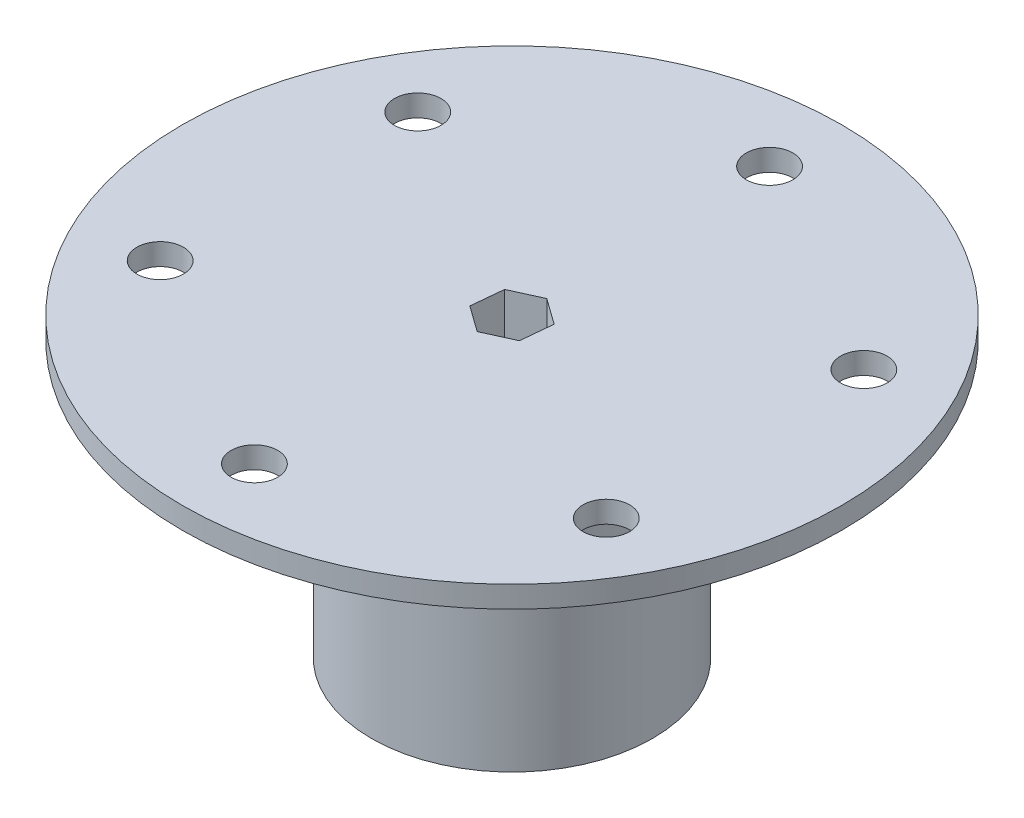
ISO-10303-21;
HEADER;
FILE_DESCRIPTION(('STEP AP214'),'2;1');
FILE_NAME('part.step','',(''),(''),'','','');
FILE_SCHEMA(('AUTOMOTIVE_DESIGN { 1 0 10303 214 1 1 1 1 }'));
ENDSEC;
DATA;
#1=APPLICATION_CONTEXT('core data for automotive mechanical design processes');
#2=APPLICATION_PROTOCOL_DEFINITION('international standard','automotive_design',2000,#1);
#3=PRODUCT_CONTEXT('',#1,'mechanical');
#4=PRODUCT('Part','Part','',(#3));
#5=PRODUCT_RELATED_PRODUCT_CATEGORY('part','',(#4));
#6=PRODUCT_DEFINITION_FORMATION('','',#4);
#7=PRODUCT_DEFINITION_CONTEXT('part definition',#1,'design');
#8=PRODUCT_DEFINITION('design','',#6,#7);
#9=PRODUCT_DEFINITION_SHAPE('','',#8);
#10=(LENGTH_UNIT() NAMED_UNIT(*) SI_UNIT(.MILLI.,.METRE.));
#11=(NAMED_UNIT(*) PLANE_ANGLE_UNIT() SI_UNIT($,.RADIAN.));
#12=(NAMED_UNIT(*) SI_UNIT($,.STERADIAN.) SOLID_ANGLE_UNIT());
#13=UNCERTAINTY_MEASURE_WITH_UNIT(LENGTH_MEASURE(1.E-05),#10,'distance_accuracy_value','');
#14=(GEOMETRIC_REPRESENTATION_CONTEXT(3) GLOBAL_UNCERTAINTY_ASSIGNED_CONTEXT((#13)) GLOBAL_UNIT_ASSIGNED_CONTEXT((#10,
#11,#12)) REPRESENTATION_CONTEXT('',''));
#15=CARTESIAN_POINT('',(0.,0.,0.));
#16=DIRECTION('',(0.,0.,1.));
#17=DIRECTION('',(1.,0.,0.));
#18=AXIS2_PLACEMENT_3D('',#15,#16,#17);
#19=CARTESIAN_POINT('',(0.,2.,0.));
#20=DIRECTION('',(0.,1.,0.));
#21=DIRECTION('',(0.,0.,1.));
#22=AXIS2_PLACEMENT_3D('',#19,#20,#21);
#23=PLANE('',#22);
#24=DIRECTION('',(-0.910380768537709,0.,0.413771502494662));
#25=VECTOR('',#24,1.);
#26=CARTESIAN_POINT('',(-1.05511733136139,2.,-2.32147095977116));
#27=LINE('',#26,#25);
#28=CARTESIAN_POINT('',(0.285184552178387,2.,-2.93064323505929));
#29=VERTEX_POINT('',#28);
#30=CARTESIAN_POINT('',(-2.39541921490117,2.,-1.71229868448302));
#31=VERTEX_POINT('',#30);
#32=EDGE_CURVE('E50',#29,#31,#27,.T.);
#33=ORIENTED_EDGE('',*,*,#32,.F.);
#34=DIRECTION('',(-0.813527016791288,0.,-0.581527121423126));
#35=VECTOR('',#34,1.);
#36=CARTESIAN_POINT('',(1.48289415962897,2.,-2.07449389281778));
#37=LINE('',#36,#35);
#38=CARTESIAN_POINT('',(2.68060376707955,2.,-1.21834455057628));
#39=VERTEX_POINT('',#38);
#40=EDGE_CURVE('E134',#39,#29,#37,.T.);
#41=ORIENTED_EDGE('',*,*,#40,.F.);
#42=DIRECTION('',(0.096853751746421,0.,-0.995298623917788));
#43=VECTOR('',#42,1.);
#44=CARTESIAN_POINT('',(2.53801149099036,2.,0.246977066953373));
#45=LINE('',#44,#43);
#46=CARTESIAN_POINT('',(2.39541921490116,2.,1.71229868448302));
#47=VERTEX_POINT('',#46);
#48=EDGE_CURVE('E93',#47,#39,#45,.T.);
#49=ORIENTED_EDGE('',*,*,#48,.F.);
#50=DIRECTION('',(0.910380768537709,0.,-0.413771502494662));
#51=VECTOR('',#50,1.);
#52=CARTESIAN_POINT('',(1.05511733136139,2.,2.32147095977116));
#53=LINE('',#52,#51);
#54=CARTESIAN_POINT('',(-0.285184552178392,2.,2.9306432350593));
#55=VERTEX_POINT('',#54);
#56=EDGE_CURVE('E130',#55,#47,#53,.T.);
#57=ORIENTED_EDGE('',*,*,#56,.F.);
#58=DIRECTION('',(0.813527016791288,0.,0.581527121423126));
#59=VECTOR('',#58,1.);
#60=CARTESIAN_POINT('',(-1.48289415962897,2.,2.07449389281779));
#61=LINE('',#60,#59);
#62=CARTESIAN_POINT('',(-2.68060376707956,2.,1.21834455057628));
#63=VERTEX_POINT('',#62);
#64=EDGE_CURVE('E127',#63,#55,#61,.T.);
#65=ORIENTED_EDGE('',*,*,#64,.F.);
#66=DIRECTION('',(-0.096853751746421,0.,0.995298623917788));
#67=VECTOR('',#66,1.);
#68=CARTESIAN_POINT('',(-2.53801149099036,2.,-0.246977066953374));
#69=LINE('',#68,#67);
#70=EDGE_CURVE('E124',#31,#63,#69,.T.);
#71=ORIENTED_EDGE('',*,*,#70,.F.);
#72=EDGE_LOOP('',(#33,#41,#49,#57,#65,#71));
#73=FACE_BOUND('',#72,.T.);
#74=CARTESIAN_POINT('',(-20.6222299276169,2.,-11.90625));
#75=DIRECTION('',(0.,1.,0.));
#76=DIRECTION('',(0.,0.,1.));
#77=AXIS2_PLACEMENT_3D('',#74,#75,#76);
#78=CIRCLE('',#77,2.15265);
#79=CARTESIAN_POINT('',(-20.6222299276169,2.,-9.7536));
#80=VERTEX_POINT('',#79);
#81=EDGE_CURVE('E151',#80,#80,#78,.T.);
#82=ORIENTED_EDGE('',*,*,#81,.F.);
#83=EDGE_LOOP('',(#82));
#84=FACE_BOUND('',#83,.T.);
#85=CARTESIAN_POINT('',(20.6222299276168,2.,-11.9062500000002));
#86=DIRECTION('',(0.,1.,0.));
#87=DIRECTION('',(0.,0.,1.));
#88=AXIS2_PLACEMENT_3D('',#85,#86,#87);
#89=CIRCLE('',#88,2.15265);
#90=CARTESIAN_POINT('',(20.6222299276168,2.,-9.75360000000024));
#91=VERTEX_POINT('',#90);
#92=EDGE_CURVE('E163',#91,#91,#89,.T.);
#93=ORIENTED_EDGE('',*,*,#92,.F.);
#94=EDGE_LOOP('',(#93));
#95=FACE_BOUND('',#94,.T.);
#96=CARTESIAN_POINT('',(0.,2.,23.8125));
#97=DIRECTION('',(0.,1.,0.));
#98=DIRECTION('',(0.,0.,1.));
#99=AXIS2_PLACEMENT_3D('',#96,#97,#98);
#100=CIRCLE('',#99,2.15265);
#101=CARTESIAN_POINT('',(0.,2.,25.96515));
#102=VERTEX_POINT('',#101);
#103=EDGE_CURVE('E175',#102,#102,#100,.T.);
#104=ORIENTED_EDGE('',*,*,#103,.F.);
#105=EDGE_LOOP('',(#104));
#106=FACE_BOUND('',#105,.T.);
#107=CARTESIAN_POINT('',(0.,2.,0.));
#108=DIRECTION('',(0.,1.,0.));
#109=DIRECTION('',(0.,0.,1.));
#110=AXIS2_PLACEMENT_3D('',#107,#108,#109);
#111=CIRCLE('',#110,30.48);
#112=CARTESIAN_POINT('',(0.,2.,30.48));
#113=VERTEX_POINT('',#112);
#114=EDGE_CURVE('E43',#113,#113,#111,.T.);
#115=ORIENTED_EDGE('',*,*,#114,.T.);
#116=EDGE_LOOP('',(#115));
#117=FACE_BOUND('',#116,.T.);
#118=CARTESIAN_POINT('',(20.622229927617,2.,11.9062499999998));
#119=DIRECTION('',(0.,1.,0.));
#120=DIRECTION('',(0.,0.,1.));
#121=AXIS2_PLACEMENT_3D('',#118,#119,#120);
#122=CIRCLE('',#121,2.15265);
#123=CARTESIAN_POINT('',(20.622229927617,2.,14.0588999999998));
#124=VERTEX_POINT('',#123);
#125=EDGE_CURVE('E169',#124,#124,#122,.T.);
#126=ORIENTED_EDGE('',*,*,#125,.F.);
#127=EDGE_LOOP('',(#126));
#128=FACE_BOUND('',#127,.T.);
#129=CARTESIAN_POINT('',(0.,2.,-23.8125));
#130=DIRECTION('',(0.,1.,0.));
#131=DIRECTION('',(0.,0.,1.));
#132=AXIS2_PLACEMENT_3D('',#129,#130,#131);
#133=CIRCLE('',#132,2.15265);
#134=CARTESIAN_POINT('',(0.,2.,-21.65985));
#135=VERTEX_POINT('',#134);
#136=EDGE_CURVE('E157',#135,#135,#133,.T.);
#137=ORIENTED_EDGE('',*,*,#136,.F.);
#138=EDGE_LOOP('',(#137));
#139=FACE_BOUND('',#138,.T.);
#140=CARTESIAN_POINT('',(-20.6222299276169,2.,11.90625));
#141=DIRECTION('',(0.,1.,0.));
#142=DIRECTION('',(0.,0.,1.));
#143=AXIS2_PLACEMENT_3D('',#140,#141,#142);
#144=CIRCLE('',#143,2.15265);
#145=CARTESIAN_POINT('',(-20.6222299276169,2.,14.0589));
#146=VERTEX_POINT('',#145);
#147=EDGE_CURVE('E145',#146,#146,#144,.T.);
#148=ORIENTED_EDGE('',*,*,#147,.F.);
#149=EDGE_LOOP('',(#148));
#150=FACE_BOUND('',#149,.T.);
#151=ADVANCED_FACE('F35',(#73,#84,#95,#106,#117,#128,#139,#150),#23,.T.);
#152=CARTESIAN_POINT('',(0.,0.,0.));
#153=DIRECTION('',(0.,1.,0.));
#154=DIRECTION('',(0.,0.,1.));
#155=AXIS2_PLACEMENT_3D('',#152,#153,#154);
#156=PLANE('',#155);
#157=CARTESIAN_POINT('',(0.,0.,0.));
#158=DIRECTION('',(0.,1.,0.));
#159=DIRECTION('',(0.,0.,1.));
#160=AXIS2_PLACEMENT_3D('',#157,#158,#159);
#161=CIRCLE('',#160,13.);
#162=CARTESIAN_POINT('',(0.,0.,13.));
#163=VERTEX_POINT('',#162);
#164=EDGE_CURVE('E11',#163,#163,#161,.F.);
#165=ORIENTED_EDGE('',*,*,#164,.F.);
#166=EDGE_LOOP('',(#165));
#167=FACE_BOUND('',#166,.T.);
#168=CARTESIAN_POINT('',(0.,0.,0.));
#169=DIRECTION('',(0.,1.,0.));
#170=DIRECTION('',(0.,0.,1.));
#171=AXIS2_PLACEMENT_3D('',#168,#169,#170);
#172=CIRCLE('',#171,30.48);
#173=CARTESIAN_POINT('',(0.,0.,30.48));
#174=VERTEX_POINT('',#173);
#175=EDGE_CURVE('E178',#174,#174,#172,.T.);
#176=ORIENTED_EDGE('',*,*,#175,.F.);
#177=EDGE_LOOP('',(#176));
#178=FACE_BOUND('',#177,.T.);
#179=CARTESIAN_POINT('',(0.,0.,23.8125));
#180=DIRECTION('',(0.,1.,0.));
#181=DIRECTION('',(0.,0.,1.));
#182=AXIS2_PLACEMENT_3D('',#179,#180,#181);
#183=CIRCLE('',#182,2.15265);
#184=CARTESIAN_POINT('',(0.,0.,25.96515));
#185=VERTEX_POINT('',#184);
#186=EDGE_CURVE('E172',#185,#185,#183,.T.);
#187=ORIENTED_EDGE('',*,*,#186,.T.);
#188=EDGE_LOOP('',(#187));
#189=FACE_BOUND('',#188,.T.);
#190=CARTESIAN_POINT('',(20.622229927617,0.,11.9062499999998));
#191=DIRECTION('',(0.,1.,0.));
#192=DIRECTION('',(0.,0.,1.));
#193=AXIS2_PLACEMENT_3D('',#190,#191,#192);
#194=CIRCLE('',#193,2.15265);
#195=CARTESIAN_POINT('',(20.622229927617,0.,14.0588999999998));
#196=VERTEX_POINT('',#195);
#197=EDGE_CURVE('E166',#196,#196,#194,.T.);
#198=ORIENTED_EDGE('',*,*,#197,.T.);
#199=EDGE_LOOP('',(#198));
#200=FACE_BOUND('',#199,.T.);
#201=CARTESIAN_POINT('',(20.6222299276168,0.,-11.9062500000002));
#202=DIRECTION('',(0.,1.,0.));
#203=DIRECTION('',(0.,0.,1.));
#204=AXIS2_PLACEMENT_3D('',#201,#202,#203);
#205=CIRCLE('',#204,2.15265);
#206=CARTESIAN_POINT('',(20.6222299276168,0.,-9.75360000000024));
#207=VERTEX_POINT('',#206);
#208=EDGE_CURVE('E160',#207,#207,#205,.T.);
#209=ORIENTED_EDGE('',*,*,#208,.T.);
#210=EDGE_LOOP('',(#209));
#211=FACE_BOUND('',#210,.T.);
#212=CARTESIAN_POINT('',(0.,0.,-23.8125));
#213=DIRECTION('',(0.,1.,0.));
#214=DIRECTION('',(0.,0.,1.));
#215=AXIS2_PLACEMENT_3D('',#212,#213,#214);
#216=CIRCLE('',#215,2.15265);
#217=CARTESIAN_POINT('',(0.,0.,-21.65985));
#218=VERTEX_POINT('',#217);
#219=EDGE_CURVE('E154',#218,#218,#216,.T.);
#220=ORIENTED_EDGE('',*,*,#219,.T.);
#221=EDGE_LOOP('',(#220));
#222=FACE_BOUND('',#221,.T.);
#223=CARTESIAN_POINT('',(-20.6222299276169,0.,-11.90625));
#224=DIRECTION('',(0.,1.,0.));
#225=DIRECTION('',(0.,0.,1.));
#226=AXIS2_PLACEMENT_3D('',#223,#224,#225);
#227=CIRCLE('',#226,2.15265);
#228=CARTESIAN_POINT('',(-20.6222299276169,0.,-9.7536));
#229=VERTEX_POINT('',#228);
#230=EDGE_CURVE('E148',#229,#229,#227,.T.);
#231=ORIENTED_EDGE('',*,*,#230,.T.);
#232=EDGE_LOOP('',(#231));
#233=FACE_BOUND('',#232,.T.);
#234=CARTESIAN_POINT('',(-20.6222299276169,0.,11.90625));
#235=DIRECTION('',(0.,1.,0.));
#236=DIRECTION('',(0.,0.,1.));
#237=AXIS2_PLACEMENT_3D('',#234,#235,#236);
#238=CIRCLE('',#237,2.15265);
#239=CARTESIAN_POINT('',(-20.6222299276169,0.,14.0589));
#240=VERTEX_POINT('',#239);
#241=EDGE_CURVE('E137',#240,#240,#238,.T.);
#242=ORIENTED_EDGE('',*,*,#241,.T.);
#243=EDGE_LOOP('',(#242));
#244=FACE_BOUND('',#243,.T.);
#245=ADVANCED_FACE('F186',(#167,#178,#189,#200,#211,#222,#233,#244),#156,.F.);
#246=CARTESIAN_POINT('',(0.,2.,0.));
#247=DIRECTION('',(0.,-1.,0.));
#248=DIRECTION('',(0.,0.,-1.));
#249=AXIS2_PLACEMENT_3D('',#246,#247,#248);
#250=CYLINDRICAL_SURFACE('',#249,30.48);
#251=ORIENTED_EDGE('',*,*,#114,.F.);
#252=EDGE_LOOP('',(#251));
#253=FACE_BOUND('',#252,.T.);
#254=ORIENTED_EDGE('',*,*,#175,.T.);
#255=EDGE_LOOP('',(#254));
#256=FACE_BOUND('',#255,.T.);
#257=ADVANCED_FACE('F37',(#253,#256),#250,.T.);
#258=CARTESIAN_POINT('',(0.,2.,23.8125));
#259=DIRECTION('',(0.,-1.,0.));
#260=DIRECTION('',(0.,0.,-1.));
#261=AXIS2_PLACEMENT_3D('',#258,#259,#260);
#262=CYLINDRICAL_SURFACE('',#261,2.15265);
#263=ORIENTED_EDGE('',*,*,#103,.T.);
#264=EDGE_LOOP('',(#263));
#265=FACE_BOUND('',#264,.T.);
#266=ORIENTED_EDGE('',*,*,#186,.F.);
#267=EDGE_LOOP('',(#266));
#268=FACE_BOUND('',#267,.T.);
#269=ADVANCED_FACE('F223',(#265,#268),#262,.F.);
#270=CARTESIAN_POINT('',(20.622229927617,2.,11.9062499999998));
#271=DIRECTION('',(0.,-1.,0.));
#272=DIRECTION('',(0.,0.,-1.));
#273=AXIS2_PLACEMENT_3D('',#270,#271,#272);
#274=CYLINDRICAL_SURFACE('',#273,2.15265);
#275=ORIENTED_EDGE('',*,*,#125,.T.);
#276=EDGE_LOOP('',(#275));
#277=FACE_BOUND('',#276,.T.);
#278=ORIENTED_EDGE('',*,*,#197,.F.);
#279=EDGE_LOOP('',(#278));
#280=FACE_BOUND('',#279,.T.);
#281=ADVANCED_FACE('F226',(#277,#280),#274,.F.);
#282=CARTESIAN_POINT('',(20.6222299276168,2.,-11.9062500000002));
#283=DIRECTION('',(0.,-1.,0.));
#284=DIRECTION('',(0.,0.,-1.));
#285=AXIS2_PLACEMENT_3D('',#282,#283,#284);
#286=CYLINDRICAL_SURFACE('',#285,2.15265);
#287=ORIENTED_EDGE('',*,*,#92,.T.);
#288=EDGE_LOOP('',(#287));
#289=FACE_BOUND('',#288,.T.);
#290=ORIENTED_EDGE('',*,*,#208,.F.);
#291=EDGE_LOOP('',(#290));
#292=FACE_BOUND('',#291,.T.);
#293=ADVANCED_FACE('F230',(#289,#292),#286,.F.);
#294=CARTESIAN_POINT('',(0.,2.,-23.8125));
#295=DIRECTION('',(0.,-1.,0.));
#296=DIRECTION('',(0.,0.,-1.));
#297=AXIS2_PLACEMENT_3D('',#294,#295,#296);
#298=CYLINDRICAL_SURFACE('',#297,2.15265);
#299=ORIENTED_EDGE('',*,*,#136,.T.);
#300=EDGE_LOOP('',(#299));
#301=FACE_BOUND('',#300,.T.);
#302=ORIENTED_EDGE('',*,*,#219,.F.);
#303=EDGE_LOOP('',(#302));
#304=FACE_BOUND('',#303,.T.);
#305=ADVANCED_FACE('F213',(#301,#304),#298,.F.);
#306=CARTESIAN_POINT('',(-20.6222299276169,2.,-11.90625));
#307=DIRECTION('',(0.,-1.,0.));
#308=DIRECTION('',(0.,0.,-1.));
#309=AXIS2_PLACEMENT_3D('',#306,#307,#308);
#310=CYLINDRICAL_SURFACE('',#309,2.15265);
#311=ORIENTED_EDGE('',*,*,#81,.T.);
#312=EDGE_LOOP('',(#311));
#313=FACE_BOUND('',#312,.T.);
#314=ORIENTED_EDGE('',*,*,#230,.F.);
#315=EDGE_LOOP('',(#314));
#316=FACE_BOUND('',#315,.T.);
#317=ADVANCED_FACE('F205',(#313,#316),#310,.F.);
#318=CARTESIAN_POINT('',(-20.6222299276169,2.,11.90625));
#319=DIRECTION('',(0.,-1.,0.));
#320=DIRECTION('',(0.,0.,-1.));
#321=AXIS2_PLACEMENT_3D('',#318,#319,#320);
#322=CYLINDRICAL_SURFACE('',#321,2.15265);
#323=ORIENTED_EDGE('',*,*,#147,.T.);
#324=EDGE_LOOP('',(#323));
#325=FACE_BOUND('',#324,.T.);
#326=ORIENTED_EDGE('',*,*,#241,.F.);
#327=EDGE_LOOP('',(#326));
#328=FACE_BOUND('',#327,.T.);
#329=ADVANCED_FACE('F202',(#325,#328),#322,.F.);
#330=CARTESIAN_POINT('',(-1.05511733136139,-8.,-2.32147095977116));
#331=DIRECTION('',(-0.413771502494662,0.,-0.910380768537709));
#332=DIRECTION('',(-0.910380768537709,0.,0.413771502494662));
#333=AXIS2_PLACEMENT_3D('',#330,#331,#332);
#334=PLANE('',#333);
#335=DIRECTION('',(0.,1.,0.));
#336=VECTOR('',#335,1.);
#337=CARTESIAN_POINT('',(0.285184552178387,-8.,-2.93064323505929));
#338=LINE('',#337,#336);
#339=CARTESIAN_POINT('',(0.285184552178388,-25.4,-2.93064323505929));
#340=VERTEX_POINT('',#339);
#341=EDGE_CURVE('E55',#340,#29,#338,.T.);
#342=ORIENTED_EDGE('',*,*,#341,.T.);
#343=ORIENTED_EDGE('',*,*,#32,.T.);
#344=DIRECTION('',(0.,1.,0.));
#345=VECTOR('',#344,1.);
#346=CARTESIAN_POINT('',(-2.39541921490117,-8.,-1.71229868448302));
#347=LINE('',#346,#345);
#348=CARTESIAN_POINT('',(-2.39541921490117,-25.4,-1.71229868448302));
#349=VERTEX_POINT('',#348);
#350=EDGE_CURVE('E136',#349,#31,#347,.T.);
#351=ORIENTED_EDGE('',*,*,#350,.F.);
#352=DIRECTION('',(-0.910380768537709,0.,0.413771502494662));
#353=VECTOR('',#352,1.);
#354=CARTESIAN_POINT('',(-1.05511733136139,-25.4,-2.32147095977116));
#355=LINE('',#354,#353);
#356=EDGE_CURVE('E103',#340,#349,#355,.T.);
#357=ORIENTED_EDGE('',*,*,#356,.F.);
#358=EDGE_LOOP('',(#342,#343,#351,#357));
#359=FACE_BOUND('',#358,.T.);
#360=ADVANCED_FACE('F204',(#359),#334,.F.);
#361=CARTESIAN_POINT('',(1.48289415962897,-8.,-2.07449389281778));
#362=DIRECTION('',(0.581527121423126,0.,-0.813527016791288));
#363=DIRECTION('',(-0.813527016791288,0.,-0.581527121423126));
#364=AXIS2_PLACEMENT_3D('',#361,#362,#363);
#365=PLANE('',#364);
#366=DIRECTION('',(0.,1.,0.));
#367=VECTOR('',#366,1.);
#368=CARTESIAN_POINT('',(2.68060376707955,-8.,-1.21834455057628));
#369=LINE('',#368,#367);
#370=CARTESIAN_POINT('',(2.68060376707955,-25.4,-1.21834455057628));
#371=VERTEX_POINT('',#370);
#372=EDGE_CURVE('E87',#371,#39,#369,.T.);
#373=ORIENTED_EDGE('',*,*,#372,.T.);
#374=ORIENTED_EDGE('',*,*,#40,.T.);
#375=ORIENTED_EDGE('',*,*,#341,.F.);
#376=DIRECTION('',(-0.813527016791288,0.,-0.581527121423126));
#377=VECTOR('',#376,1.);
#378=CARTESIAN_POINT('',(1.48289415962897,-25.4,-2.07449389281778));
#379=LINE('',#378,#377);
#380=EDGE_CURVE('E99',#371,#340,#379,.T.);
#381=ORIENTED_EDGE('',*,*,#380,.F.);
#382=EDGE_LOOP('',(#373,#374,#375,#381));
#383=FACE_BOUND('',#382,.T.);
#384=ADVANCED_FACE('F100',(#383),#365,.F.);
#385=CARTESIAN_POINT('',(2.53801149099036,-8.,0.246977066953373));
#386=DIRECTION('',(0.995298623917788,0.,0.096853751746421));
#387=DIRECTION('',(0.096853751746421,0.,-0.995298623917788));
#388=AXIS2_PLACEMENT_3D('',#385,#386,#387);
#389=PLANE('',#388);
#390=DIRECTION('',(0.,1.,0.));
#391=VECTOR('',#390,1.);
#392=CARTESIAN_POINT('',(2.39541921490116,-8.,1.71229868448302));
#393=LINE('',#392,#391);
#394=CARTESIAN_POINT('',(2.39541921490116,-25.4,1.71229868448302));
#395=VERTEX_POINT('',#394);
#396=EDGE_CURVE('E96',#395,#47,#393,.T.);
#397=ORIENTED_EDGE('',*,*,#396,.T.);
#398=ORIENTED_EDGE('',*,*,#48,.T.);
#399=ORIENTED_EDGE('',*,*,#372,.F.);
#400=DIRECTION('',(0.096853751746421,0.,-0.995298623917788));
#401=VECTOR('',#400,1.);
#402=CARTESIAN_POINT('',(2.53801149099036,-25.4,0.246977066953373));
#403=LINE('',#402,#401);
#404=EDGE_CURVE('E91',#395,#371,#403,.T.);
#405=ORIENTED_EDGE('',*,*,#404,.F.);
#406=EDGE_LOOP('',(#397,#398,#399,#405));
#407=FACE_BOUND('',#406,.T.);
#408=ADVANCED_FACE('F89',(#407),#389,.F.);
#409=CARTESIAN_POINT('',(1.05511733136139,-8.,2.32147095977116));
#410=DIRECTION('',(0.413771502494662,0.,0.910380768537709));
#411=DIRECTION('',(0.910380768537709,0.,-0.413771502494662));
#412=AXIS2_PLACEMENT_3D('',#409,#410,#411);
#413=PLANE('',#412);
#414=DIRECTION('',(0.,1.,0.));
#415=VECTOR('',#414,1.);
#416=CARTESIAN_POINT('',(-0.285184552178392,-8.,2.9306432350593));
#417=LINE('',#416,#415);
#418=CARTESIAN_POINT('',(-0.285184552178392,-25.4,2.9306432350593));
#419=VERTEX_POINT('',#418);
#420=EDGE_CURVE('E140',#419,#55,#417,.T.);
#421=ORIENTED_EDGE('',*,*,#420,.T.);
#422=ORIENTED_EDGE('',*,*,#56,.T.);
#423=ORIENTED_EDGE('',*,*,#396,.F.);
#424=DIRECTION('',(0.910380768537709,0.,-0.413771502494662));
#425=VECTOR('',#424,1.);
#426=CARTESIAN_POINT('',(1.05511733136139,-25.4,2.32147095977116));
#427=LINE('',#426,#425);
#428=EDGE_CURVE('E110',#419,#395,#427,.T.);
#429=ORIENTED_EDGE('',*,*,#428,.F.);
#430=EDGE_LOOP('',(#421,#422,#423,#429));
#431=FACE_BOUND('',#430,.T.);
#432=ADVANCED_FACE('F293',(#431),#413,.F.);
#433=CARTESIAN_POINT('',(-1.48289415962897,-8.,2.07449389281779));
#434=DIRECTION('',(-0.581527121423126,0.,0.813527016791288));
#435=DIRECTION('',(0.813527016791288,0.,0.581527121423126));
#436=AXIS2_PLACEMENT_3D('',#433,#434,#435);
#437=PLANE('',#436);
#438=DIRECTION('',(0.,1.,0.));
#439=VECTOR('',#438,1.);
#440=CARTESIAN_POINT('',(-2.68060376707956,-8.,1.21834455057628));
#441=LINE('',#440,#439);
#442=CARTESIAN_POINT('',(-2.68060376707956,-25.4,1.21834455057628));
#443=VERTEX_POINT('',#442);
#444=EDGE_CURVE('E142',#443,#63,#441,.T.);
#445=ORIENTED_EDGE('',*,*,#444,.T.);
#446=ORIENTED_EDGE('',*,*,#64,.T.);
#447=ORIENTED_EDGE('',*,*,#420,.F.);
#448=DIRECTION('',(0.813527016791288,0.,0.581527121423126));
#449=VECTOR('',#448,1.);
#450=CARTESIAN_POINT('',(-1.48289415962897,-25.4,2.07449389281779));
#451=LINE('',#450,#449);
#452=EDGE_CURVE('E117',#443,#419,#451,.T.);
#453=ORIENTED_EDGE('',*,*,#452,.F.);
#454=EDGE_LOOP('',(#445,#446,#447,#453));
#455=FACE_BOUND('',#454,.T.);
#456=ADVANCED_FACE('F303',(#455),#437,.F.);
#457=CARTESIAN_POINT('',(-2.53801149099036,-8.,-0.246977066953374));
#458=DIRECTION('',(-0.995298623917788,0.,-0.096853751746421));
#459=DIRECTION('',(-0.096853751746421,0.,0.995298623917788));
#460=AXIS2_PLACEMENT_3D('',#457,#458,#459);
#461=PLANE('',#460);
#462=ORIENTED_EDGE('',*,*,#350,.T.);
#463=ORIENTED_EDGE('',*,*,#70,.T.);
#464=ORIENTED_EDGE('',*,*,#444,.F.);
#465=DIRECTION('',(-0.096853751746421,0.,0.995298623917788));
#466=VECTOR('',#465,1.);
#467=CARTESIAN_POINT('',(-2.53801149099036,-25.4,-0.246977066953374));
#468=LINE('',#467,#466);
#469=EDGE_CURVE('E114',#349,#443,#468,.T.);
#470=ORIENTED_EDGE('',*,*,#469,.F.);
#471=EDGE_LOOP('',(#462,#463,#464,#470));
#472=FACE_BOUND('',#471,.T.);
#473=ADVANCED_FACE('F314',(#472),#461,.F.);
#474=CARTESIAN_POINT('',(0.,-25.4,0.));
#475=DIRECTION('',(0.,1.,0.));
#476=DIRECTION('',(0.,0.,1.));
#477=AXIS2_PLACEMENT_3D('',#474,#475,#476);
#478=CYLINDRICAL_SURFACE('',#477,13.);
#479=CARTESIAN_POINT('',(0.,-25.4,0.));
#480=DIRECTION('',(0.,-1.,0.));
#481=DIRECTION('',(0.,0.,-1.));
#482=AXIS2_PLACEMENT_3D('',#479,#480,#481);
#483=CIRCLE('',#482,13.);
#484=CARTESIAN_POINT('',(0.,-25.4,-13.));
#485=VERTEX_POINT('',#484);
#486=EDGE_CURVE('E120',#485,#485,#483,.T.);
#487=ORIENTED_EDGE('',*,*,#486,.F.);
#488=EDGE_LOOP('',(#487));
#489=FACE_BOUND('',#488,.T.);
#490=ORIENTED_EDGE('',*,*,#164,.T.);
#491=EDGE_LOOP('',(#490));
#492=FACE_BOUND('',#491,.T.);
#493=ADVANCED_FACE('F325',(#489,#492),#478,.T.);
#494=CARTESIAN_POINT('',(0.,-25.4,0.));
#495=DIRECTION('',(0.,-1.,0.));
#496=DIRECTION('',(0.,0.,-1.));
#497=AXIS2_PLACEMENT_3D('',#494,#495,#496);
#498=PLANE('',#497);
#499=ORIENTED_EDGE('',*,*,#404,.T.);
#500=ORIENTED_EDGE('',*,*,#380,.T.);
#501=ORIENTED_EDGE('',*,*,#356,.T.);
#502=ORIENTED_EDGE('',*,*,#469,.T.);
#503=ORIENTED_EDGE('',*,*,#452,.T.);
#504=ORIENTED_EDGE('',*,*,#428,.T.);
#505=EDGE_LOOP('',(#499,#500,#501,#502,#503,#504));
#506=FACE_BOUND('',#505,.T.);
#507=ORIENTED_EDGE('',*,*,#486,.T.);
#508=EDGE_LOOP('',(#507));
#509=FACE_BOUND('',#508,.T.);
#510=ADVANCED_FACE('F106',(#506,#509),#498,.T.);
#511=CLOSED_SHELL('',(#151,#245,#257,#269,#281,#293,#305,#317,#329,#360,#384,#408,#432,#456,
#473,#493,#510));
#512=MANIFOLD_SOLID_BREP('B2',#511);
#513=ADVANCED_BREP_SHAPE_REPRESENTATION('',(#18,#512),#14);
#514=SHAPE_DEFINITION_REPRESENTATION(#9,#513);
ENDSEC;
END-ISO-10303-21;
